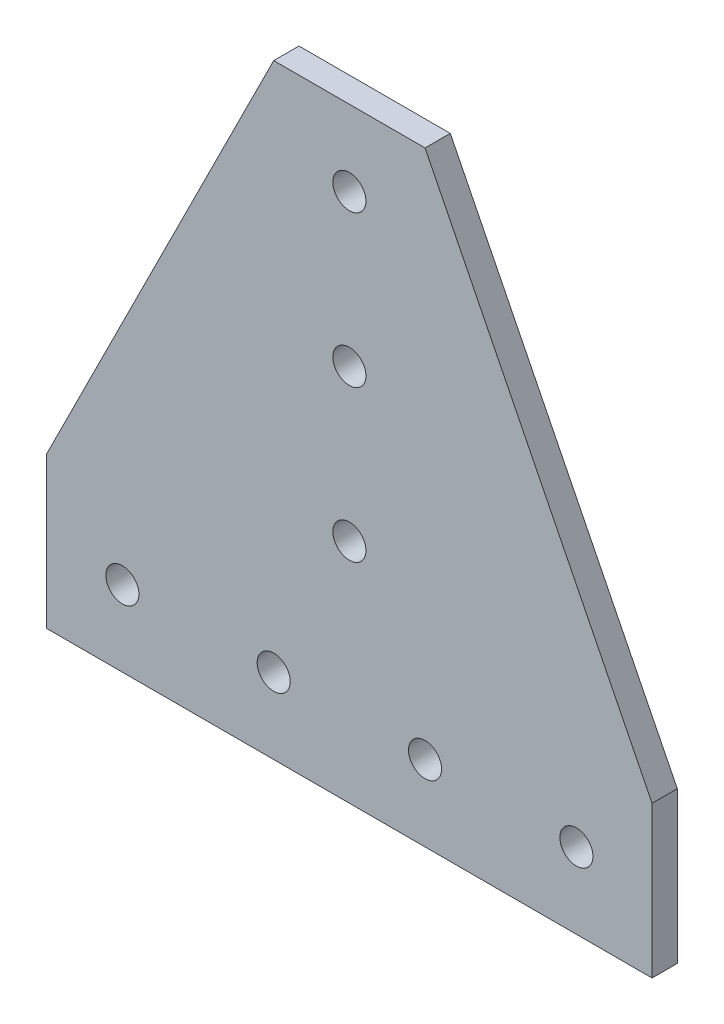
ISO-10303-21;
HEADER;
FILE_DESCRIPTION(('STEP AP214'),'2;1');
FILE_NAME('part.step','',(''),(''),'','','');
FILE_SCHEMA(('AUTOMOTIVE_DESIGN { 1 0 10303 214 1 1 1 1 }'));
ENDSEC;
DATA;
#1=APPLICATION_CONTEXT('core data for automotive mechanical design processes');
#2=APPLICATION_PROTOCOL_DEFINITION('international standard','automotive_design',2000,#1);
#3=PRODUCT_CONTEXT('',#1,'mechanical');
#4=PRODUCT('Part','Part','',(#3));
#5=PRODUCT_RELATED_PRODUCT_CATEGORY('part','',(#4));
#6=PRODUCT_DEFINITION_FORMATION('','',#4);
#7=PRODUCT_DEFINITION_CONTEXT('part definition',#1,'design');
#8=PRODUCT_DEFINITION('design','',#6,#7);
#9=PRODUCT_DEFINITION_SHAPE('','',#8);
#10=(LENGTH_UNIT() NAMED_UNIT(*) SI_UNIT(.MILLI.,.METRE.));
#11=(NAMED_UNIT(*) PLANE_ANGLE_UNIT() SI_UNIT($,.RADIAN.));
#12=(NAMED_UNIT(*) SI_UNIT($,.STERADIAN.) SOLID_ANGLE_UNIT());
#13=UNCERTAINTY_MEASURE_WITH_UNIT(LENGTH_MEASURE(1.E-05),#10,'distance_accuracy_value','');
#14=(GEOMETRIC_REPRESENTATION_CONTEXT(3) GLOBAL_UNCERTAINTY_ASSIGNED_CONTEXT((#13)) GLOBAL_UNIT_ASSIGNED_CONTEXT((#10,
#11,#12)) REPRESENTATION_CONTEXT('',''));
#15=CARTESIAN_POINT('',(0.,0.,0.));
#16=DIRECTION('',(0.,0.,1.));
#17=DIRECTION('',(1.,0.,0.));
#18=AXIS2_PLACEMENT_3D('',#15,#16,#17);
#19=CARTESIAN_POINT('',(0.,0.,6.35));
#20=DIRECTION('',(0.,0.,-1.));
#21=DIRECTION('',(-1.,0.,0.));
#22=AXIS2_PLACEMENT_3D('',#19,#20,#21);
#23=PLANE('',#22);
#24=DIRECTION('',(1.,0.,0.));
#25=VECTOR('',#24,1.);
#26=CARTESIAN_POINT('',(152.4,0.,6.35));
#27=LINE('',#26,#25);
#28=CARTESIAN_POINT('',(0.,0.,6.35));
#29=VERTEX_POINT('',#28);
#30=CARTESIAN_POINT('',(152.4,0.,6.35));
#31=VERTEX_POINT('',#30);
#32=EDGE_CURVE('E146',#29,#31,#27,.T.);
#33=ORIENTED_EDGE('',*,*,#32,.T.);
#34=DIRECTION('',(0.,1.,0.));
#35=VECTOR('',#34,1.);
#36=CARTESIAN_POINT('',(152.4,38.1,6.35));
#37=LINE('',#36,#35);
#38=CARTESIAN_POINT('',(152.4,38.1,6.35));
#39=VERTEX_POINT('',#38);
#40=EDGE_CURVE('E94',#31,#39,#37,.T.);
#41=ORIENTED_EDGE('',*,*,#40,.T.);
#42=DIRECTION('',(-0.447213595499958,0.894427190999916,0.));
#43=VECTOR('',#42,1.);
#44=CARTESIAN_POINT('',(152.4,38.1,6.35));
#45=LINE('',#44,#43);
#46=CARTESIAN_POINT('',(95.25,152.4,6.35));
#47=VERTEX_POINT('',#46);
#48=EDGE_CURVE('E107',#39,#47,#45,.T.);
#49=ORIENTED_EDGE('',*,*,#48,.T.);
#50=DIRECTION('',(-1.,0.,0.));
#51=VECTOR('',#50,1.);
#52=CARTESIAN_POINT('',(57.15,152.4,6.35));
#53=LINE('',#52,#51);
#54=CARTESIAN_POINT('',(57.15,152.4,6.35));
#55=VERTEX_POINT('',#54);
#56=EDGE_CURVE('E101',#47,#55,#53,.T.);
#57=ORIENTED_EDGE('',*,*,#56,.T.);
#58=DIRECTION('',(-0.447213595499958,-0.894427190999916,0.));
#59=VECTOR('',#58,1.);
#60=CARTESIAN_POINT('',(0.,38.1,6.35));
#61=LINE('',#60,#59);
#62=CARTESIAN_POINT('',(0.,38.1,6.35));
#63=VERTEX_POINT('',#62);
#64=EDGE_CURVE('E105',#55,#63,#61,.T.);
#65=ORIENTED_EDGE('',*,*,#64,.T.);
#66=DIRECTION('',(0.,-1.,0.));
#67=VECTOR('',#66,1.);
#68=CARTESIAN_POINT('',(0.,0.,6.35));
#69=LINE('',#68,#67);
#70=EDGE_CURVE('E57',#63,#29,#69,.T.);
#71=ORIENTED_EDGE('',*,*,#70,.T.);
#72=EDGE_LOOP('',(#33,#41,#49,#57,#65,#71));
#73=FACE_BOUND('',#72,.T.);
#74=CARTESIAN_POINT('',(19.05,19.05,6.35));
#75=DIRECTION('',(0.,0.,1.));
#76=DIRECTION('',(1.,0.,0.));
#77=AXIS2_PLACEMENT_3D('',#74,#75,#76);
#78=CIRCLE('',#77,4.1656);
#79=CARTESIAN_POINT('',(23.2156,19.05,6.35));
#80=VERTEX_POINT('',#79);
#81=EDGE_CURVE('E134',#80,#80,#78,.T.);
#82=ORIENTED_EDGE('',*,*,#81,.F.);
#83=EDGE_LOOP('',(#82));
#84=FACE_BOUND('',#83,.T.);
#85=CARTESIAN_POINT('',(57.15,19.05,6.35));
#86=DIRECTION('',(0.,0.,1.));
#87=DIRECTION('',(1.,0.,0.));
#88=AXIS2_PLACEMENT_3D('',#85,#86,#87);
#89=CIRCLE('',#88,4.1656);
#90=CARTESIAN_POINT('',(61.3156,19.05,6.35));
#91=VERTEX_POINT('',#90);
#92=EDGE_CURVE('E254',#91,#91,#89,.T.);
#93=ORIENTED_EDGE('',*,*,#92,.F.);
#94=EDGE_LOOP('',(#93));
#95=FACE_BOUND('',#94,.T.);
#96=CARTESIAN_POINT('',(95.25,19.05,6.35));
#97=DIRECTION('',(0.,0.,1.));
#98=DIRECTION('',(1.,0.,0.));
#99=AXIS2_PLACEMENT_3D('',#96,#97,#98);
#100=CIRCLE('',#99,4.1656);
#101=CARTESIAN_POINT('',(99.4156,19.05,6.35));
#102=VERTEX_POINT('',#101);
#103=EDGE_CURVE('E246',#102,#102,#100,.T.);
#104=ORIENTED_EDGE('',*,*,#103,.F.);
#105=EDGE_LOOP('',(#104));
#106=FACE_BOUND('',#105,.T.);
#107=CARTESIAN_POINT('',(133.35,19.05,6.35));
#108=DIRECTION('',(0.,0.,1.));
#109=DIRECTION('',(1.,0.,0.));
#110=AXIS2_PLACEMENT_3D('',#107,#108,#109);
#111=CIRCLE('',#110,4.1656);
#112=CARTESIAN_POINT('',(137.5156,19.05,6.35));
#113=VERTEX_POINT('',#112);
#114=EDGE_CURVE('E238',#113,#113,#111,.T.);
#115=ORIENTED_EDGE('',*,*,#114,.F.);
#116=EDGE_LOOP('',(#115));
#117=FACE_BOUND('',#116,.T.);
#118=CARTESIAN_POINT('',(76.2000000000002,133.35,6.35));
#119=DIRECTION('',(0.,0.,1.));
#120=DIRECTION('',(1.,0.,0.));
#121=AXIS2_PLACEMENT_3D('',#118,#119,#120);
#122=CIRCLE('',#121,4.1655999999998);
#123=CARTESIAN_POINT('',(80.3656,133.35,6.35));
#124=VERTEX_POINT('',#123);
#125=EDGE_CURVE('E230',#124,#124,#122,.T.);
#126=ORIENTED_EDGE('',*,*,#125,.F.);
#127=EDGE_LOOP('',(#126));
#128=FACE_BOUND('',#127,.T.);
#129=CARTESIAN_POINT('',(76.2000000000004,95.25,6.35));
#130=DIRECTION('',(0.,0.,1.));
#131=DIRECTION('',(1.,0.,0.));
#132=AXIS2_PLACEMENT_3D('',#129,#130,#131);
#133=CIRCLE('',#132,4.1656);
#134=CARTESIAN_POINT('',(80.3656000000004,95.25,6.35));
#135=VERTEX_POINT('',#134);
#136=EDGE_CURVE('E222',#135,#135,#133,.T.);
#137=ORIENTED_EDGE('',*,*,#136,.F.);
#138=EDGE_LOOP('',(#137));
#139=FACE_BOUND('',#138,.T.);
#140=CARTESIAN_POINT('',(76.2000000000008,57.15,6.35));
#141=DIRECTION('',(0.,0.,1.));
#142=DIRECTION('',(1.,0.,0.));
#143=AXIS2_PLACEMENT_3D('',#140,#141,#142);
#144=CIRCLE('',#143,4.1656);
#145=CARTESIAN_POINT('',(80.3656000000008,57.15,6.35));
#146=VERTEX_POINT('',#145);
#147=EDGE_CURVE('E211',#146,#146,#144,.T.);
#148=ORIENTED_EDGE('',*,*,#147,.F.);
#149=EDGE_LOOP('',(#148));
#150=FACE_BOUND('',#149,.T.);
#151=ADVANCED_FACE('F39',(#73,#84,#95,#106,#117,#128,#139,#150),#23,.F.);
#152=CARTESIAN_POINT('',(0.,0.,0.));
#153=DIRECTION('',(0.,0.,-1.));
#154=DIRECTION('',(-1.,0.,0.));
#155=AXIS2_PLACEMENT_3D('',#152,#153,#154);
#156=PLANE('',#155);
#157=CARTESIAN_POINT('',(76.2000000000004,95.25,0.));
#158=DIRECTION('',(0.,0.,1.));
#159=DIRECTION('',(1.,0.,0.));
#160=AXIS2_PLACEMENT_3D('',#157,#158,#159);
#161=CIRCLE('',#160,4.1656);
#162=CARTESIAN_POINT('',(80.3656000000004,95.25,0.));
#163=VERTEX_POINT('',#162);
#164=EDGE_CURVE('E219',#163,#163,#161,.T.);
#165=ORIENTED_EDGE('',*,*,#164,.T.);
#166=EDGE_LOOP('',(#165));
#167=FACE_BOUND('',#166,.T.);
#168=CARTESIAN_POINT('',(133.35,19.05,0.));
#169=DIRECTION('',(0.,0.,1.));
#170=DIRECTION('',(1.,0.,0.));
#171=AXIS2_PLACEMENT_3D('',#168,#169,#170);
#172=CIRCLE('',#171,4.1656);
#173=CARTESIAN_POINT('',(137.5156,19.05,0.));
#174=VERTEX_POINT('',#173);
#175=EDGE_CURVE('E234',#174,#174,#172,.T.);
#176=ORIENTED_EDGE('',*,*,#175,.T.);
#177=EDGE_LOOP('',(#176));
#178=FACE_BOUND('',#177,.T.);
#179=CARTESIAN_POINT('',(57.15,19.05,0.));
#180=DIRECTION('',(0.,0.,1.));
#181=DIRECTION('',(1.,0.,0.));
#182=AXIS2_PLACEMENT_3D('',#179,#180,#181);
#183=CIRCLE('',#182,4.1656);
#184=CARTESIAN_POINT('',(61.3156,19.05,0.));
#185=VERTEX_POINT('',#184);
#186=EDGE_CURVE('E250',#185,#185,#183,.T.);
#187=ORIENTED_EDGE('',*,*,#186,.T.);
#188=EDGE_LOOP('',(#187));
#189=FACE_BOUND('',#188,.T.);
#190=DIRECTION('',(1.,0.,0.));
#191=VECTOR('',#190,1.);
#192=CARTESIAN_POINT('',(152.4,0.,0.));
#193=LINE('',#192,#191);
#194=CARTESIAN_POINT('',(0.,0.,0.));
#195=VERTEX_POINT('',#194);
#196=CARTESIAN_POINT('',(152.4,0.,0.));
#197=VERTEX_POINT('',#196);
#198=EDGE_CURVE('E129',#195,#197,#193,.T.);
#199=ORIENTED_EDGE('',*,*,#198,.F.);
#200=DIRECTION('',(0.,-1.,0.));
#201=VECTOR('',#200,1.);
#202=CARTESIAN_POINT('',(0.,0.,0.));
#203=LINE('',#202,#201);
#204=CARTESIAN_POINT('',(0.,38.1,0.));
#205=VERTEX_POINT('',#204);
#206=EDGE_CURVE('E86',#205,#195,#203,.T.);
#207=ORIENTED_EDGE('',*,*,#206,.F.);
#208=DIRECTION('',(-0.447213595499958,-0.894427190999916,0.));
#209=VECTOR('',#208,1.);
#210=CARTESIAN_POINT('',(0.,38.1,0.));
#211=LINE('',#210,#209);
#212=CARTESIAN_POINT('',(57.15,152.4,0.));
#213=VERTEX_POINT('',#212);
#214=EDGE_CURVE('E80',#213,#205,#211,.T.);
#215=ORIENTED_EDGE('',*,*,#214,.F.);
#216=DIRECTION('',(-1.,0.,0.));
#217=VECTOR('',#216,1.);
#218=CARTESIAN_POINT('',(57.15,152.4,0.));
#219=LINE('',#218,#217);
#220=CARTESIAN_POINT('',(95.25,152.4,0.));
#221=VERTEX_POINT('',#220);
#222=EDGE_CURVE('E116',#221,#213,#219,.T.);
#223=ORIENTED_EDGE('',*,*,#222,.F.);
#224=DIRECTION('',(-0.447213595499958,0.894427190999916,0.));
#225=VECTOR('',#224,1.);
#226=CARTESIAN_POINT('',(152.4,38.1,0.));
#227=LINE('',#226,#225);
#228=CARTESIAN_POINT('',(152.4,38.1,0.));
#229=VERTEX_POINT('',#228);
#230=EDGE_CURVE('E137',#229,#221,#227,.T.);
#231=ORIENTED_EDGE('',*,*,#230,.F.);
#232=DIRECTION('',(0.,1.,0.));
#233=VECTOR('',#232,1.);
#234=CARTESIAN_POINT('',(152.4,38.1,0.));
#235=LINE('',#234,#233);
#236=EDGE_CURVE('E133',#197,#229,#235,.T.);
#237=ORIENTED_EDGE('',*,*,#236,.F.);
#238=EDGE_LOOP('',(#199,#207,#215,#223,#231,#237));
#239=FACE_BOUND('',#238,.T.);
#240=CARTESIAN_POINT('',(19.05,19.05,0.));
#241=DIRECTION('',(0.,0.,1.));
#242=DIRECTION('',(1.,0.,0.));
#243=AXIS2_PLACEMENT_3D('',#240,#241,#242);
#244=CIRCLE('',#243,4.1656);
#245=CARTESIAN_POINT('',(23.2156,19.05,0.));
#246=VERTEX_POINT('',#245);
#247=EDGE_CURVE('E258',#246,#246,#244,.T.);
#248=ORIENTED_EDGE('',*,*,#247,.T.);
#249=EDGE_LOOP('',(#248));
#250=FACE_BOUND('',#249,.T.);
#251=CARTESIAN_POINT('',(95.25,19.05,0.));
#252=DIRECTION('',(0.,0.,1.));
#253=DIRECTION('',(1.,0.,0.));
#254=AXIS2_PLACEMENT_3D('',#251,#252,#253);
#255=CIRCLE('',#254,4.1656);
#256=CARTESIAN_POINT('',(99.4156,19.05,0.));
#257=VERTEX_POINT('',#256);
#258=EDGE_CURVE('E242',#257,#257,#255,.T.);
#259=ORIENTED_EDGE('',*,*,#258,.T.);
#260=EDGE_LOOP('',(#259));
#261=FACE_BOUND('',#260,.T.);
#262=CARTESIAN_POINT('',(76.2000000000002,133.35,0.));
#263=DIRECTION('',(0.,0.,1.));
#264=DIRECTION('',(1.,0.,0.));
#265=AXIS2_PLACEMENT_3D('',#262,#263,#264);
#266=CIRCLE('',#265,4.1655999999998);
#267=CARTESIAN_POINT('',(80.3656,133.35,0.));
#268=VERTEX_POINT('',#267);
#269=EDGE_CURVE('E226',#268,#268,#266,.T.);
#270=ORIENTED_EDGE('',*,*,#269,.T.);
#271=EDGE_LOOP('',(#270));
#272=FACE_BOUND('',#271,.T.);
#273=CARTESIAN_POINT('',(76.2000000000008,57.15,0.));
#274=DIRECTION('',(0.,0.,1.));
#275=DIRECTION('',(1.,0.,0.));
#276=AXIS2_PLACEMENT_3D('',#273,#274,#275);
#277=CIRCLE('',#276,4.1656);
#278=CARTESIAN_POINT('',(80.3656000000008,57.15,0.));
#279=VERTEX_POINT('',#278);
#280=EDGE_CURVE('E214',#279,#279,#277,.T.);
#281=ORIENTED_EDGE('',*,*,#280,.T.);
#282=EDGE_LOOP('',(#281));
#283=FACE_BOUND('',#282,.T.);
#284=ADVANCED_FACE('F159',(#167,#178,#189,#239,#250,#261,#272,#283),#156,.T.);
#285=CARTESIAN_POINT('',(152.4,0.,6.35));
#286=DIRECTION('',(0.,1.,0.));
#287=DIRECTION('',(-1.,0.,0.));
#288=AXIS2_PLACEMENT_3D('',#285,#286,#287);
#289=PLANE('',#288);
#290=ORIENTED_EDGE('',*,*,#198,.T.);
#291=DIRECTION('',(0.,0.,-1.));
#292=VECTOR('',#291,1.);
#293=CARTESIAN_POINT('',(152.4,0.,6.35));
#294=LINE('',#293,#292);
#295=EDGE_CURVE('E11',#31,#197,#294,.T.);
#296=ORIENTED_EDGE('',*,*,#295,.F.);
#297=ORIENTED_EDGE('',*,*,#32,.F.);
#298=DIRECTION('',(0.,0.,-1.));
#299=VECTOR('',#298,1.);
#300=CARTESIAN_POINT('',(0.,0.,6.35));
#301=LINE('',#300,#299);
#302=EDGE_CURVE('E125',#29,#195,#301,.T.);
#303=ORIENTED_EDGE('',*,*,#302,.T.);
#304=EDGE_LOOP('',(#290,#296,#297,#303));
#305=FACE_BOUND('',#304,.T.);
#306=ADVANCED_FACE('F41',(#305),#289,.F.);
#307=CARTESIAN_POINT('',(152.4,38.1,6.35));
#308=DIRECTION('',(-1.,0.,0.));
#309=DIRECTION('',(0.,0.,1.));
#310=AXIS2_PLACEMENT_3D('',#307,#308,#309);
#311=PLANE('',#310);
#312=ORIENTED_EDGE('',*,*,#236,.T.);
#313=DIRECTION('',(0.,0.,-1.));
#314=VECTOR('',#313,1.);
#315=CARTESIAN_POINT('',(152.4,38.1,6.35));
#316=LINE('',#315,#314);
#317=EDGE_CURVE('E49',#39,#229,#316,.T.);
#318=ORIENTED_EDGE('',*,*,#317,.F.);
#319=ORIENTED_EDGE('',*,*,#40,.F.);
#320=ORIENTED_EDGE('',*,*,#295,.T.);
#321=EDGE_LOOP('',(#312,#318,#319,#320));
#322=FACE_BOUND('',#321,.T.);
#323=ADVANCED_FACE('F351',(#322),#311,.F.);
#324=CARTESIAN_POINT('',(152.4,38.1,6.35));
#325=DIRECTION('',(-0.894427190999916,-0.447213595499958,0.));
#326=DIRECTION('',(0.447213595499958,-0.894427190999916,0.));
#327=AXIS2_PLACEMENT_3D('',#324,#325,#326);
#328=PLANE('',#327);
#329=ORIENTED_EDGE('',*,*,#230,.T.);
#330=DIRECTION('',(0.,0.,-1.));
#331=VECTOR('',#330,1.);
#332=CARTESIAN_POINT('',(95.25,152.4,6.35));
#333=LINE('',#332,#331);
#334=EDGE_CURVE('E118',#47,#221,#333,.T.);
#335=ORIENTED_EDGE('',*,*,#334,.F.);
#336=ORIENTED_EDGE('',*,*,#48,.F.);
#337=ORIENTED_EDGE('',*,*,#317,.T.);
#338=EDGE_LOOP('',(#329,#335,#336,#337));
#339=FACE_BOUND('',#338,.T.);
#340=ADVANCED_FACE('F156',(#339),#328,.F.);
#341=CARTESIAN_POINT('',(57.15,152.4,6.35));
#342=DIRECTION('',(0.,-1.,0.));
#343=DIRECTION('',(1.,0.,0.));
#344=AXIS2_PLACEMENT_3D('',#341,#342,#343);
#345=PLANE('',#344);
#346=ORIENTED_EDGE('',*,*,#222,.T.);
#347=DIRECTION('',(0.,0.,-1.));
#348=VECTOR('',#347,1.);
#349=CARTESIAN_POINT('',(57.15,152.4,6.35));
#350=LINE('',#349,#348);
#351=EDGE_CURVE('E113',#55,#213,#350,.T.);
#352=ORIENTED_EDGE('',*,*,#351,.F.);
#353=ORIENTED_EDGE('',*,*,#56,.F.);
#354=ORIENTED_EDGE('',*,*,#334,.T.);
#355=EDGE_LOOP('',(#346,#352,#353,#354));
#356=FACE_BOUND('',#355,.T.);
#357=ADVANCED_FACE('F114',(#356),#345,.F.);
#358=CARTESIAN_POINT('',(0.,38.1,6.35));
#359=DIRECTION('',(0.894427190999916,-0.447213595499958,0.));
#360=DIRECTION('',(0.447213595499958,0.894427190999916,0.));
#361=AXIS2_PLACEMENT_3D('',#358,#359,#360);
#362=PLANE('',#361);
#363=ORIENTED_EDGE('',*,*,#214,.T.);
#364=DIRECTION('',(0.,0.,-1.));
#365=VECTOR('',#364,1.);
#366=CARTESIAN_POINT('',(0.,38.1,6.35));
#367=LINE('',#366,#365);
#368=EDGE_CURVE('E119',#63,#205,#367,.T.);
#369=ORIENTED_EDGE('',*,*,#368,.F.);
#370=ORIENTED_EDGE('',*,*,#64,.F.);
#371=ORIENTED_EDGE('',*,*,#351,.T.);
#372=EDGE_LOOP('',(#363,#369,#370,#371));
#373=FACE_BOUND('',#372,.T.);
#374=ADVANCED_FACE('F121',(#373),#362,.F.);
#375=CARTESIAN_POINT('',(0.,0.,6.35));
#376=DIRECTION('',(1.,0.,0.));
#377=DIRECTION('',(0.,0.,-1.));
#378=AXIS2_PLACEMENT_3D('',#375,#376,#377);
#379=PLANE('',#378);
#380=ORIENTED_EDGE('',*,*,#206,.T.);
#381=ORIENTED_EDGE('',*,*,#302,.F.);
#382=ORIENTED_EDGE('',*,*,#70,.F.);
#383=ORIENTED_EDGE('',*,*,#368,.T.);
#384=EDGE_LOOP('',(#380,#381,#382,#383));
#385=FACE_BOUND('',#384,.T.);
#386=ADVANCED_FACE('F164',(#385),#379,.F.);
#387=CARTESIAN_POINT('',(19.05,19.05,6.35));
#388=DIRECTION('',(0.,0.,-1.));
#389=DIRECTION('',(-1.,0.,0.));
#390=AXIS2_PLACEMENT_3D('',#387,#388,#389);
#391=CYLINDRICAL_SURFACE('',#390,4.1656);
#392=ORIENTED_EDGE('',*,*,#81,.T.);
#393=EDGE_LOOP('',(#392));
#394=FACE_BOUND('',#393,.T.);
#395=ORIENTED_EDGE('',*,*,#247,.F.);
#396=EDGE_LOOP('',(#395));
#397=FACE_BOUND('',#396,.T.);
#398=ADVANCED_FACE('F166',(#394,#397),#391,.F.);
#399=CARTESIAN_POINT('',(57.15,19.05,6.35));
#400=DIRECTION('',(0.,0.,-1.));
#401=DIRECTION('',(-1.,0.,0.));
#402=AXIS2_PLACEMENT_3D('',#399,#400,#401);
#403=CYLINDRICAL_SURFACE('',#402,4.1656);
#404=ORIENTED_EDGE('',*,*,#92,.T.);
#405=EDGE_LOOP('',(#404));
#406=FACE_BOUND('',#405,.T.);
#407=ORIENTED_EDGE('',*,*,#186,.F.);
#408=EDGE_LOOP('',(#407));
#409=FACE_BOUND('',#408,.T.);
#410=ADVANCED_FACE('F172',(#406,#409),#403,.F.);
#411=CARTESIAN_POINT('',(95.25,19.05,6.35));
#412=DIRECTION('',(0.,0.,-1.));
#413=DIRECTION('',(-1.,0.,0.));
#414=AXIS2_PLACEMENT_3D('',#411,#412,#413);
#415=CYLINDRICAL_SURFACE('',#414,4.1656);
#416=ORIENTED_EDGE('',*,*,#103,.T.);
#417=EDGE_LOOP('',(#416));
#418=FACE_BOUND('',#417,.T.);
#419=ORIENTED_EDGE('',*,*,#258,.F.);
#420=EDGE_LOOP('',(#419));
#421=FACE_BOUND('',#420,.T.);
#422=ADVANCED_FACE('F186',(#418,#421),#415,.F.);
#423=CARTESIAN_POINT('',(133.35,19.05,6.35));
#424=DIRECTION('',(0.,0.,-1.));
#425=DIRECTION('',(-1.,0.,0.));
#426=AXIS2_PLACEMENT_3D('',#423,#424,#425);
#427=CYLINDRICAL_SURFACE('',#426,4.1656);
#428=ORIENTED_EDGE('',*,*,#114,.T.);
#429=EDGE_LOOP('',(#428));
#430=FACE_BOUND('',#429,.T.);
#431=ORIENTED_EDGE('',*,*,#175,.F.);
#432=EDGE_LOOP('',(#431));
#433=FACE_BOUND('',#432,.T.);
#434=ADVANCED_FACE('F190',(#430,#433),#427,.F.);
#435=CARTESIAN_POINT('',(76.2000000000002,133.35,6.35));
#436=DIRECTION('',(0.,0.,-1.));
#437=DIRECTION('',(-1.,0.,0.));
#438=AXIS2_PLACEMENT_3D('',#435,#436,#437);
#439=CYLINDRICAL_SURFACE('',#438,4.1655999999998);
#440=ORIENTED_EDGE('',*,*,#125,.T.);
#441=EDGE_LOOP('',(#440));
#442=FACE_BOUND('',#441,.T.);
#443=ORIENTED_EDGE('',*,*,#269,.F.);
#444=EDGE_LOOP('',(#443));
#445=FACE_BOUND('',#444,.T.);
#446=ADVANCED_FACE('F194',(#442,#445),#439,.F.);
#447=CARTESIAN_POINT('',(76.2000000000004,95.25,6.35));
#448=DIRECTION('',(0.,0.,-1.));
#449=DIRECTION('',(-1.,0.,0.));
#450=AXIS2_PLACEMENT_3D('',#447,#448,#449);
#451=CYLINDRICAL_SURFACE('',#450,4.1656);
#452=ORIENTED_EDGE('',*,*,#136,.T.);
#453=EDGE_LOOP('',(#452));
#454=FACE_BOUND('',#453,.T.);
#455=ORIENTED_EDGE('',*,*,#164,.F.);
#456=EDGE_LOOP('',(#455));
#457=FACE_BOUND('',#456,.T.);
#458=ADVANCED_FACE('F198',(#454,#457),#451,.F.);
#459=CARTESIAN_POINT('',(76.2000000000008,57.15,6.35));
#460=DIRECTION('',(0.,0.,-1.));
#461=DIRECTION('',(-1.,0.,0.));
#462=AXIS2_PLACEMENT_3D('',#459,#460,#461);
#463=CYLINDRICAL_SURFACE('',#462,4.1656);
#464=ORIENTED_EDGE('',*,*,#147,.T.);
#465=EDGE_LOOP('',(#464));
#466=FACE_BOUND('',#465,.T.);
#467=ORIENTED_EDGE('',*,*,#280,.F.);
#468=EDGE_LOOP('',(#467));
#469=FACE_BOUND('',#468,.T.);
#470=ADVANCED_FACE('F202',(#466,#469),#463,.F.);
#471=CLOSED_SHELL('',(#151,#284,#306,#323,#340,#357,#374,#386,#398,#410,#422,#434,#446,#458,#470));
#472=MANIFOLD_SOLID_BREP('B2',#471);
#473=ADVANCED_BREP_SHAPE_REPRESENTATION('',(#18,#472),#14);
#474=SHAPE_DEFINITION_REPRESENTATION(#9,#473);
ENDSEC;
END-ISO-10303-21;
